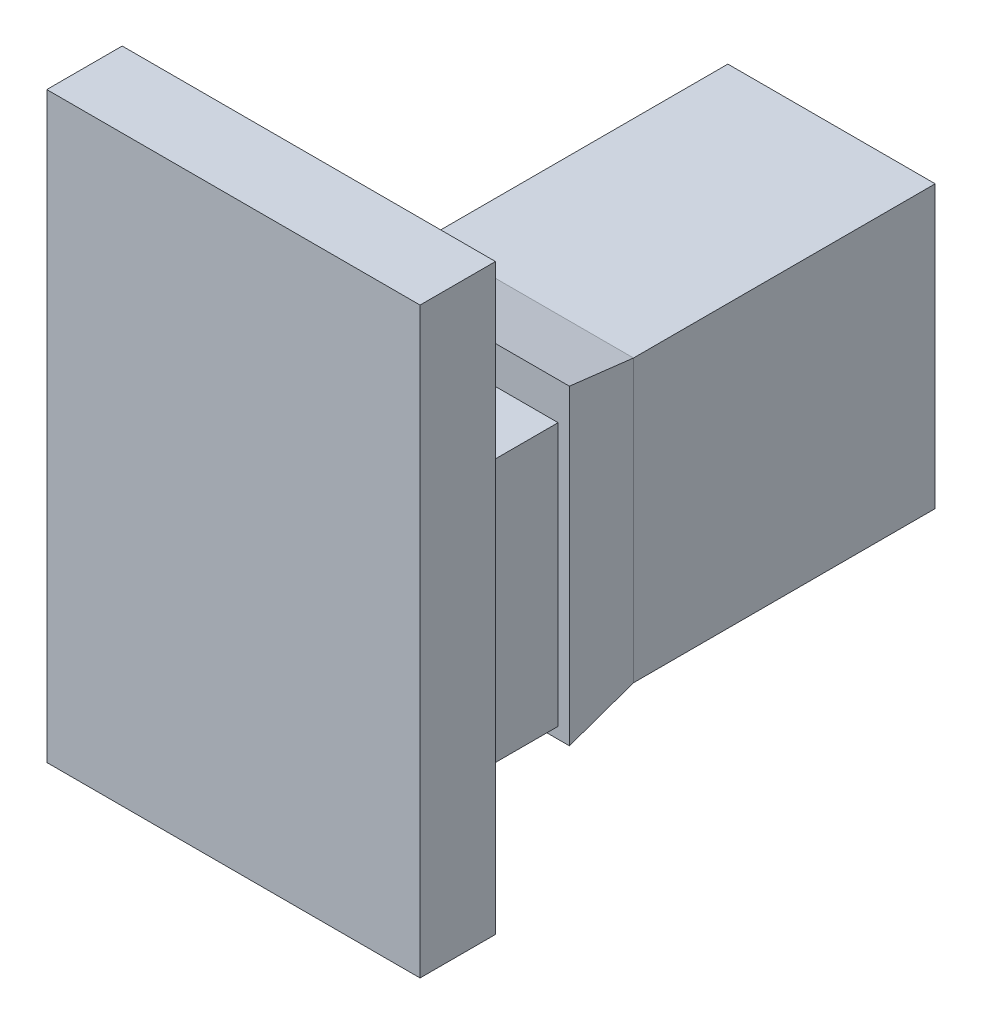
ISO-10303-21;
HEADER;
FILE_DESCRIPTION(('STEP AP214'),'2;1');
FILE_NAME('part.step','',(''),(''),'','','');
FILE_SCHEMA(('AUTOMOTIVE_DESIGN { 1 0 10303 214 1 1 1 1 }'));
ENDSEC;
DATA;
#1=APPLICATION_CONTEXT('core data for automotive mechanical design processes');
#2=APPLICATION_PROTOCOL_DEFINITION('international standard','automotive_design',2000,#1);
#3=PRODUCT_CONTEXT('',#1,'mechanical');
#4=PRODUCT('Part','Part','',(#3));
#5=PRODUCT_RELATED_PRODUCT_CATEGORY('part','',(#4));
#6=PRODUCT_DEFINITION_FORMATION('','',#4);
#7=PRODUCT_DEFINITION_CONTEXT('part definition',#1,'design');
#8=PRODUCT_DEFINITION('design','',#6,#7);
#9=PRODUCT_DEFINITION_SHAPE('','',#8);
#10=(LENGTH_UNIT() NAMED_UNIT(*) SI_UNIT(.MILLI.,.METRE.));
#11=(NAMED_UNIT(*) PLANE_ANGLE_UNIT() SI_UNIT($,.RADIAN.));
#12=(NAMED_UNIT(*) SI_UNIT($,.STERADIAN.) SOLID_ANGLE_UNIT());
#13=UNCERTAINTY_MEASURE_WITH_UNIT(LENGTH_MEASURE(1.E-05),#10,'distance_accuracy_value','');
#14=(GEOMETRIC_REPRESENTATION_CONTEXT(3) GLOBAL_UNCERTAINTY_ASSIGNED_CONTEXT((#13)) GLOBAL_UNIT_ASSIGNED_CONTEXT((#10,
#11,#12)) REPRESENTATION_CONTEXT('',''));
#15=CARTESIAN_POINT('',(0.,0.,0.));
#16=DIRECTION('',(0.,0.,1.));
#17=DIRECTION('',(1.,0.,0.));
#18=AXIS2_PLACEMENT_3D('',#15,#16,#17);
#19=CARTESIAN_POINT('',(-4.1990001587635,-32.943584134306,-1.7));
#20=DIRECTION('',(-1.,0.,0.));
#21=DIRECTION('',(0.,-1.,0.));
#22=AXIS2_PLACEMENT_3D('',#19,#20,#21);
#23=PLANE('',#22);
#24=DIRECTION('',(0.,0.,1.));
#25=VECTOR('',#24,1.);
#26=CARTESIAN_POINT('',(-4.1990001587635,-36.4302303117521,-1.7));
#27=LINE('',#26,#25);
#28=CARTESIAN_POINT('',(-4.1990001587635,-36.4302303117521,-1.7));
#29=VERTEX_POINT('',#28);
#30=CARTESIAN_POINT('',(-4.1990001587635,-36.4302303117521,0.2));
#31=VERTEX_POINT('',#30);
#32=EDGE_CURVE('E516',#29,#31,#27,.T.);
#33=ORIENTED_EDGE('',*,*,#32,.T.);
#34=DIRECTION('',(0.,-1.,0.));
#35=VECTOR('',#34,1.);
#36=CARTESIAN_POINT('',(-4.1990001587635,-32.943584134306,0.2));
#37=LINE('',#36,#35);
#38=CARTESIAN_POINT('',(-4.1990001587635,-32.943584134306,0.2));
#39=VERTEX_POINT('',#38);
#40=EDGE_CURVE('E520',#39,#31,#37,.T.);
#41=ORIENTED_EDGE('',*,*,#40,.F.);
#42=DIRECTION('',(0.,0.,1.));
#43=VECTOR('',#42,1.);
#44=CARTESIAN_POINT('',(-4.1990001587635,-32.943584134306,-1.7));
#45=LINE('',#44,#43);
#46=CARTESIAN_POINT('',(-4.1990001587635,-32.943584134306,-1.7));
#47=VERTEX_POINT('',#46);
#48=EDGE_CURVE('E13',#47,#39,#45,.T.);
#49=ORIENTED_EDGE('',*,*,#48,.F.);
#50=DIRECTION('',(0.,-1.,0.));
#51=VECTOR('',#50,1.);
#52=CARTESIAN_POINT('',(-4.1990001587635,-32.943584134306,-1.7));
#53=LINE('',#52,#51);
#54=EDGE_CURVE('E521',#47,#29,#53,.T.);
#55=ORIENTED_EDGE('',*,*,#54,.T.);
#56=EDGE_LOOP('',(#33,#41,#49,#55));
#57=FACE_BOUND('',#56,.T.);
#58=ADVANCED_FACE('F104',(#57),#23,.T.);
#59=CARTESIAN_POINT('',(-4.1990001587635,-32.943584134306,-1.7));
#60=DIRECTION('',(0.,1.,0.));
#61=DIRECTION('',(0.,0.,1.));
#62=AXIS2_PLACEMENT_3D('',#59,#60,#61);
#63=PLANE('',#62);
#64=ORIENTED_EDGE('',*,*,#48,.T.);
#65=DIRECTION('',(-1.,0.,0.));
#66=VECTOR('',#65,1.);
#67=CARTESIAN_POINT('',(-4.1990001587635,-32.943584134306,0.2));
#68=LINE('',#67,#66);
#69=CARTESIAN_POINT('',(-1.450000158763,-32.943584134306,0.2));
#70=VERTEX_POINT('',#69);
#71=EDGE_CURVE('E537',#70,#39,#68,.T.);
#72=ORIENTED_EDGE('',*,*,#71,.F.);
#73=DIRECTION('',(0.,0.,1.));
#74=VECTOR('',#73,1.);
#75=CARTESIAN_POINT('',(-1.450000158763,-32.943584134306,-1.7));
#76=LINE('',#75,#74);
#77=CARTESIAN_POINT('',(-1.450000158763,-32.943584134306,-1.7));
#78=VERTEX_POINT('',#77);
#79=EDGE_CURVE('E114',#78,#70,#76,.T.);
#80=ORIENTED_EDGE('',*,*,#79,.F.);
#81=DIRECTION('',(-1.,0.,0.));
#82=VECTOR('',#81,1.);
#83=CARTESIAN_POINT('',(-4.1990001587635,-32.943584134306,-1.7));
#84=LINE('',#83,#82);
#85=EDGE_CURVE('E525',#78,#47,#84,.T.);
#86=ORIENTED_EDGE('',*,*,#85,.T.);
#87=EDGE_LOOP('',(#64,#72,#80,#86));
#88=FACE_BOUND('',#87,.T.);
#89=ADVANCED_FACE('F501',(#88),#63,.T.);
#90=CARTESIAN_POINT('',(-1.450000158763,-32.943584134306,-1.7));
#91=DIRECTION('',(1.,0.,0.));
#92=DIRECTION('',(0.,1.,0.));
#93=AXIS2_PLACEMENT_3D('',#90,#91,#92);
#94=PLANE('',#93);
#95=ORIENTED_EDGE('',*,*,#79,.T.);
#96=DIRECTION('',(0.,1.,0.));
#97=VECTOR('',#96,1.);
#98=CARTESIAN_POINT('',(-1.450000158763,-32.943584134306,0.2));
#99=LINE('',#98,#97);
#100=CARTESIAN_POINT('',(-1.450000158763,-36.4302303117521,0.2));
#101=VERTEX_POINT('',#100);
#102=EDGE_CURVE('E533',#101,#70,#99,.T.);
#103=ORIENTED_EDGE('',*,*,#102,.F.);
#104=DIRECTION('',(0.,0.,1.));
#105=VECTOR('',#104,1.);
#106=CARTESIAN_POINT('',(-1.450000158763,-36.4302303117521,-1.7));
#107=LINE('',#106,#105);
#108=CARTESIAN_POINT('',(-1.450000158763,-36.4302303117521,-1.7));
#109=VERTEX_POINT('',#108);
#110=EDGE_CURVE('E524',#109,#101,#107,.T.);
#111=ORIENTED_EDGE('',*,*,#110,.F.);
#112=DIRECTION('',(0.,1.,0.));
#113=VECTOR('',#112,1.);
#114=CARTESIAN_POINT('',(-1.450000158763,-32.943584134306,-1.7));
#115=LINE('',#114,#113);
#116=EDGE_CURVE('E130',#109,#78,#115,.T.);
#117=ORIENTED_EDGE('',*,*,#116,.T.);
#118=EDGE_LOOP('',(#95,#103,#111,#117));
#119=FACE_BOUND('',#118,.T.);
#120=ADVANCED_FACE('F504',(#119),#94,.T.);
#121=CARTESIAN_POINT('',(-4.1990001587635,-36.4302303117521,-1.7));
#122=DIRECTION('',(0.,-1.,0.));
#123=DIRECTION('',(0.,0.,-1.));
#124=AXIS2_PLACEMENT_3D('',#121,#122,#123);
#125=PLANE('',#124);
#126=ORIENTED_EDGE('',*,*,#110,.T.);
#127=DIRECTION('',(1.,0.,0.));
#128=VECTOR('',#127,1.);
#129=CARTESIAN_POINT('',(-4.1990001587635,-36.4302303117521,0.2));
#130=LINE('',#129,#128);
#131=EDGE_CURVE('E528',#31,#101,#130,.T.);
#132=ORIENTED_EDGE('',*,*,#131,.F.);
#133=ORIENTED_EDGE('',*,*,#32,.F.);
#134=DIRECTION('',(1.,0.,0.));
#135=VECTOR('',#134,1.);
#136=CARTESIAN_POINT('',(-4.1990001587635,-36.4302303117521,-1.7));
#137=LINE('',#136,#135);
#138=EDGE_CURVE('E553',#29,#109,#137,.T.);
#139=ORIENTED_EDGE('',*,*,#138,.T.);
#140=EDGE_LOOP('',(#126,#132,#133,#139));
#141=FACE_BOUND('',#140,.T.);
#142=ADVANCED_FACE('F485',(#141),#125,.T.);
#143=CARTESIAN_POINT('',(0.,0.,0.2));
#144=DIRECTION('',(0.,0.,1.));
#145=DIRECTION('',(1.,0.,0.));
#146=AXIS2_PLACEMENT_3D('',#143,#144,#145);
#147=PLANE('',#146);
#148=DIRECTION('',(0.,1.,0.));
#149=VECTOR('',#148,1.);
#150=CARTESIAN_POINT('',(-0.380302431480573,-29.6082267360027,0.2));
#151=LINE('',#150,#149);
#152=CARTESIAN_POINT('',(-0.380302431480572,-37.3350996987134,0.2));
#153=VERTEX_POINT('',#152);
#154=CARTESIAN_POINT('',(-0.380302431480573,-29.6082267360027,0.2));
#155=VERTEX_POINT('',#154);
#156=EDGE_CURVE('E584',#153,#155,#151,.T.);
#157=ORIENTED_EDGE('',*,*,#156,.F.);
#158=DIRECTION('',(1.,0.,0.));
#159=VECTOR('',#158,1.);
#160=CARTESIAN_POINT('',(-5.32928908669653,-37.3350996987134,0.2));
#161=LINE('',#160,#159);
#162=CARTESIAN_POINT('',(-5.32928908669653,-37.3350996987134,0.2));
#163=VERTEX_POINT('',#162);
#164=EDGE_CURVE('E619',#163,#153,#161,.T.);
#165=ORIENTED_EDGE('',*,*,#164,.F.);
#166=DIRECTION('',(0.,-1.,0.));
#167=VECTOR('',#166,1.);
#168=CARTESIAN_POINT('',(-5.32928908669653,-29.6082267360027,0.2));
#169=LINE('',#168,#167);
#170=CARTESIAN_POINT('',(-5.32928908669653,-29.6082267360027,0.2));
#171=VERTEX_POINT('',#170);
#172=EDGE_CURVE('E625',#171,#163,#169,.T.);
#173=ORIENTED_EDGE('',*,*,#172,.F.);
#174=DIRECTION('',(-1.,0.,0.));
#175=VECTOR('',#174,1.);
#176=CARTESIAN_POINT('',(-5.32928908669653,-29.6082267360027,0.2));
#177=LINE('',#176,#175);
#178=EDGE_CURVE('E631',#155,#171,#177,.T.);
#179=ORIENTED_EDGE('',*,*,#178,.F.);
#180=EDGE_LOOP('',(#157,#165,#173,#179));
#181=FACE_BOUND('',#180,.T.);
#182=ORIENTED_EDGE('',*,*,#71,.T.);
#183=ORIENTED_EDGE('',*,*,#40,.T.);
#184=ORIENTED_EDGE('',*,*,#131,.T.);
#185=ORIENTED_EDGE('',*,*,#102,.T.);
#186=EDGE_LOOP('',(#182,#183,#184,#185));
#187=FACE_BOUND('',#186,.T.);
#188=ADVANCED_FACE('F481',(#181,#187),#147,.F.);
#189=CARTESIAN_POINT('',(-0.380302431480573,-29.6082267360027,1.2));
#190=DIRECTION('',(-1.,0.,0.));
#191=DIRECTION('',(0.,-1.,0.));
#192=AXIS2_PLACEMENT_3D('',#189,#190,#191);
#193=PLANE('',#192);
#194=ORIENTED_EDGE('',*,*,#156,.T.);
#195=DIRECTION('',(0.,0.,-1.));
#196=VECTOR('',#195,1.);
#197=CARTESIAN_POINT('',(-0.380302431480573,-29.6082267360027,1.2));
#198=LINE('',#197,#196);
#199=CARTESIAN_POINT('',(-0.380302431480573,-29.6082267360027,1.2));
#200=VERTEX_POINT('',#199);
#201=EDGE_CURVE('E539',#200,#155,#198,.T.);
#202=ORIENTED_EDGE('',*,*,#201,.F.);
#203=DIRECTION('',(0.,1.,0.));
#204=VECTOR('',#203,1.);
#205=CARTESIAN_POINT('',(-0.380302431480573,-29.6082267360027,1.2));
#206=LINE('',#205,#204);
#207=CARTESIAN_POINT('',(-0.380302431480572,-37.3350996987134,1.2));
#208=VERTEX_POINT('',#207);
#209=EDGE_CURVE('E464',#208,#200,#206,.T.);
#210=ORIENTED_EDGE('',*,*,#209,.F.);
#211=DIRECTION('',(0.,0.,-1.));
#212=VECTOR('',#211,1.);
#213=CARTESIAN_POINT('',(-0.380302431480572,-37.3350996987134,1.2));
#214=LINE('',#213,#212);
#215=EDGE_CURVE('E635',#208,#153,#214,.T.);
#216=ORIENTED_EDGE('',*,*,#215,.T.);
#217=EDGE_LOOP('',(#194,#202,#210,#216));
#218=FACE_BOUND('',#217,.T.);
#219=ADVANCED_FACE('F484',(#218),#193,.F.);
#220=CARTESIAN_POINT('',(-5.32928908669653,-29.6082267360027,1.2));
#221=DIRECTION('',(0.,-1.,0.));
#222=DIRECTION('',(0.,0.,-1.));
#223=AXIS2_PLACEMENT_3D('',#220,#221,#222);
#224=PLANE('',#223);
#225=ORIENTED_EDGE('',*,*,#178,.T.);
#226=DIRECTION('',(0.,0.,-1.));
#227=VECTOR('',#226,1.);
#228=CARTESIAN_POINT('',(-5.32928908669653,-29.6082267360027,1.2));
#229=LINE('',#228,#227);
#230=CARTESIAN_POINT('',(-5.32928908669653,-29.6082267360027,1.2));
#231=VERTEX_POINT('',#230);
#232=EDGE_CURVE('E544',#231,#171,#229,.T.);
#233=ORIENTED_EDGE('',*,*,#232,.F.);
#234=DIRECTION('',(-1.,0.,0.));
#235=VECTOR('',#234,1.);
#236=CARTESIAN_POINT('',(-5.32928908669653,-29.6082267360027,1.2));
#237=LINE('',#236,#235);
#238=EDGE_CURVE('E618',#200,#231,#237,.T.);
#239=ORIENTED_EDGE('',*,*,#238,.F.);
#240=ORIENTED_EDGE('',*,*,#201,.T.);
#241=EDGE_LOOP('',(#225,#233,#239,#240));
#242=FACE_BOUND('',#241,.T.);
#243=ADVANCED_FACE('F493',(#242),#224,.F.);
#244=CARTESIAN_POINT('',(-5.32928908669653,-29.6082267360027,1.2));
#245=DIRECTION('',(1.,0.,0.));
#246=DIRECTION('',(0.,1.,0.));
#247=AXIS2_PLACEMENT_3D('',#244,#245,#246);
#248=PLANE('',#247);
#249=ORIENTED_EDGE('',*,*,#172,.T.);
#250=DIRECTION('',(0.,0.,-1.));
#251=VECTOR('',#250,1.);
#252=CARTESIAN_POINT('',(-5.32928908669653,-37.3350996987134,1.2));
#253=LINE('',#252,#251);
#254=CARTESIAN_POINT('',(-5.32928908669653,-37.3350996987134,1.2));
#255=VERTEX_POINT('',#254);
#256=EDGE_CURVE('E638',#255,#163,#253,.T.);
#257=ORIENTED_EDGE('',*,*,#256,.F.);
#258=DIRECTION('',(0.,-1.,0.));
#259=VECTOR('',#258,1.);
#260=CARTESIAN_POINT('',(-5.32928908669653,-29.6082267360027,1.2));
#261=LINE('',#260,#259);
#262=EDGE_CURVE('E623',#231,#255,#261,.T.);
#263=ORIENTED_EDGE('',*,*,#262,.F.);
#264=ORIENTED_EDGE('',*,*,#232,.T.);
#265=EDGE_LOOP('',(#249,#257,#263,#264));
#266=FACE_BOUND('',#265,.T.);
#267=ADVANCED_FACE('F489',(#266),#248,.F.);
#268=CARTESIAN_POINT('',(-5.32928908669653,-37.3350996987134,1.2));
#269=DIRECTION('',(0.,1.,0.));
#270=DIRECTION('',(0.,0.,1.));
#271=AXIS2_PLACEMENT_3D('',#268,#269,#270);
#272=PLANE('',#271);
#273=ORIENTED_EDGE('',*,*,#164,.T.);
#274=ORIENTED_EDGE('',*,*,#215,.F.);
#275=DIRECTION('',(1.,0.,0.));
#276=VECTOR('',#275,1.);
#277=CARTESIAN_POINT('',(-5.32928908669653,-37.3350996987134,1.2));
#278=LINE('',#277,#276);
#279=EDGE_CURVE('E639',#255,#208,#278,.T.);
#280=ORIENTED_EDGE('',*,*,#279,.F.);
#281=ORIENTED_EDGE('',*,*,#256,.T.);
#282=EDGE_LOOP('',(#273,#274,#280,#281));
#283=FACE_BOUND('',#282,.T.);
#284=ADVANCED_FACE('F479',(#283),#272,.F.);
#285=CARTESIAN_POINT('',(0.,0.,1.2));
#286=DIRECTION('',(0.,0.,1.));
#287=DIRECTION('',(1.,0.,0.));
#288=AXIS2_PLACEMENT_3D('',#285,#286,#287);
#289=PLANE('',#288);
#290=ORIENTED_EDGE('',*,*,#209,.T.);
#291=ORIENTED_EDGE('',*,*,#238,.T.);
#292=ORIENTED_EDGE('',*,*,#262,.T.);
#293=ORIENTED_EDGE('',*,*,#279,.T.);
#294=EDGE_LOOP('',(#290,#291,#292,#293));
#295=FACE_BOUND('',#294,.T.);
#296=ADVANCED_FACE('F476',(#295),#289,.T.);
#297=CARTESIAN_POINT('',(0.,0.,-1.7));
#298=DIRECTION('',(0.,0.,1.));
#299=DIRECTION('',(1.,0.,0.));
#300=AXIS2_PLACEMENT_3D('',#297,#298,#299);
#301=PLANE('',#300);
#302=DIRECTION('',(0.,1.,0.));
#303=VECTOR('',#302,1.);
#304=CARTESIAN_POINT('',(-4.2990001587635,-32.4496116621969,-1.7));
#305=LINE('',#304,#303);
#306=CARTESIAN_POINT('',(-4.2990001587635,-36.5795323520586,-1.7));
#307=VERTEX_POINT('',#306);
#308=CARTESIAN_POINT('',(-4.2990001587635,-32.4496116621969,-1.7));
#309=VERTEX_POINT('',#308);
#310=EDGE_CURVE('E312',#307,#309,#305,.T.);
#311=ORIENTED_EDGE('',*,*,#310,.F.);
#312=DIRECTION('',(-1.,0.,0.));
#313=VECTOR('',#312,1.);
#314=CARTESIAN_POINT('',(-4.2990001587635,-36.5795323520586,-1.7));
#315=LINE('',#314,#313);
#316=CARTESIAN_POINT('',(-1.300000158763,-36.5795323520586,-1.7));
#317=VERTEX_POINT('',#316);
#318=EDGE_CURVE('E568',#317,#307,#315,.T.);
#319=ORIENTED_EDGE('',*,*,#318,.F.);
#320=DIRECTION('',(0.,-1.,0.));
#321=VECTOR('',#320,1.);
#322=CARTESIAN_POINT('',(-1.300000158763,-32.4496116621969,-1.7));
#323=LINE('',#322,#321);
#324=CARTESIAN_POINT('',(-1.300000158763,-32.4496116621969,-1.7));
#325=VERTEX_POINT('',#324);
#326=EDGE_CURVE('E573',#325,#317,#323,.T.);
#327=ORIENTED_EDGE('',*,*,#326,.F.);
#328=DIRECTION('',(1.,0.,0.));
#329=VECTOR('',#328,1.);
#330=CARTESIAN_POINT('',(-4.2990001587635,-32.4496116621969,-1.7));
#331=LINE('',#330,#329);
#332=EDGE_CURVE('E578',#309,#325,#331,.T.);
#333=ORIENTED_EDGE('',*,*,#332,.F.);
#334=EDGE_LOOP('',(#311,#319,#327,#333));
#335=FACE_BOUND('',#334,.T.);
#336=ORIENTED_EDGE('',*,*,#54,.F.);
#337=ORIENTED_EDGE('',*,*,#85,.F.);
#338=ORIENTED_EDGE('',*,*,#116,.F.);
#339=ORIENTED_EDGE('',*,*,#138,.F.);
#340=EDGE_LOOP('',(#336,#337,#338,#339));
#341=FACE_BOUND('',#340,.T.);
#342=ADVANCED_FACE('F431',(#335,#341),#301,.T.);
#343=CARTESIAN_POINT('',(-1.450000158763,-36.4302303117521,-2.7));
#344=DIRECTION('',(0.988936352868298,0.,-0.148340452930244));
#345=DIRECTION('',(0.,1.,0.));
#346=AXIS2_PLACEMENT_3D('',#343,#344,#345);
#347=PLANE('',#346);
#348=DIRECTION('',(0.,-1.,0.));
#349=VECTOR('',#348,1.);
#350=CARTESIAN_POINT('',(-1.450000158763,-32.7006216370123,-2.7));
#351=LINE('',#350,#349);
#352=CARTESIAN_POINT('',(-1.450000158763,-32.7006216370123,-2.7));
#353=VERTEX_POINT('',#352);
#354=CARTESIAN_POINT('',(-1.450000158763,-36.4302303117521,-2.7));
#355=VERTEX_POINT('',#354);
#356=EDGE_CURVE('E324',#353,#355,#351,.T.);
#357=ORIENTED_EDGE('',*,*,#356,.F.);
#358=CARTESIAN_POINT('',(-1.450000158763,-32.7006216370123,-2.7));
#359=CARTESIAN_POINT('',(-1.400000158763,-32.6169516454071,-2.36666666666667));
#360=CARTESIAN_POINT('',(-1.350000158763,-32.533281653802,-2.03333333333333));
#361=CARTESIAN_POINT('',(-1.300000158763,-32.4496116621969,-1.7));
#362=B_SPLINE_CURVE_WITH_KNOTS('',3,(#358,#359,#360,#361),.UNSPECIFIED.,.F.,.F.,(4,4),(0.,1.),.UNSPECIFIED.);
#363=EDGE_CURVE('E301',#353,#325,#362,.T.);
#364=ORIENTED_EDGE('',*,*,#363,.T.);
#365=ORIENTED_EDGE('',*,*,#326,.T.);
#366=CARTESIAN_POINT('',(-1.450000158763,-36.4302303117521,-2.7));
#367=CARTESIAN_POINT('',(-1.400000158763,-36.4799976585209,-2.36666666666667));
#368=CARTESIAN_POINT('',(-1.350000158763,-36.5297650052898,-2.03333333333333));
#369=CARTESIAN_POINT('',(-1.300000158763,-36.5795323520586,-1.7));
#370=B_SPLINE_CURVE_WITH_KNOTS('',3,(#366,#367,#368,#369),.UNSPECIFIED.,.F.,.F.,(4,4),(0.,1.),.UNSPECIFIED.);
#371=EDGE_CURVE('E297',#355,#317,#370,.T.);
#372=ORIENTED_EDGE('',*,*,#371,.F.);
#373=EDGE_LOOP('',(#357,#364,#365,#372));
#374=FACE_BOUND('',#373,.T.);
#375=ADVANCED_FACE('F420',(#374),#347,.T.);
#376=CARTESIAN_POINT('',(-4.1990001587635,-36.4302303117521,-2.7));
#377=DIRECTION('',(0.,-0.989037390138069,-0.14766530028709));
#378=DIRECTION('',(1.,0.,0.));
#379=AXIS2_PLACEMENT_3D('',#376,#377,#378);
#380=PLANE('',#379);
#381=DIRECTION('',(-1.,0.,0.));
#382=VECTOR('',#381,1.);
#383=CARTESIAN_POINT('',(-1.450000158763,-36.4302303117521,-2.7));
#384=LINE('',#383,#382);
#385=CARTESIAN_POINT('',(-4.1990001587635,-36.4302303117521,-2.7));
#386=VERTEX_POINT('',#385);
#387=EDGE_CURVE('E107',#355,#386,#384,.T.);
#388=ORIENTED_EDGE('',*,*,#387,.F.);
#389=ORIENTED_EDGE('',*,*,#371,.T.);
#390=ORIENTED_EDGE('',*,*,#318,.T.);
#391=CARTESIAN_POINT('',(-4.1990001587635,-36.4302303117521,-2.7));
#392=CARTESIAN_POINT('',(-4.23233349209683,-36.4799976585209,-2.36666666666667));
#393=CARTESIAN_POINT('',(-4.26566682543017,-36.5297650052898,-2.03333333333333));
#394=CARTESIAN_POINT('',(-4.2990001587635,-36.5795323520586,-1.7));
#395=B_SPLINE_CURVE_WITH_KNOTS('',3,(#391,#392,#393,#394),.UNSPECIFIED.,.F.,.F.,(4,4),(0.,1.),.UNSPECIFIED.);
#396=EDGE_CURVE('E302',#386,#307,#395,.T.);
#397=ORIENTED_EDGE('',*,*,#396,.F.);
#398=EDGE_LOOP('',(#388,#389,#390,#397));
#399=FACE_BOUND('',#398,.T.);
#400=ADVANCED_FACE('F430',(#399),#380,.T.);
#401=CARTESIAN_POINT('',(-4.1990001587635,-32.7006216370123,-2.7));
#402=DIRECTION('',(-0.995037190209989,0.,-0.099503719021));
#403=DIRECTION('',(0.,-1.,0.));
#404=AXIS2_PLACEMENT_3D('',#401,#402,#403);
#405=PLANE('',#404);
#406=DIRECTION('',(0.,1.,0.));
#407=VECTOR('',#406,1.);
#408=CARTESIAN_POINT('',(-4.1990001587635,-36.4302303117521,-2.7));
#409=LINE('',#408,#407);
#410=CARTESIAN_POINT('',(-4.1990001587635,-32.7006216370123,-2.7));
#411=VERTEX_POINT('',#410);
#412=EDGE_CURVE('E397',#386,#411,#409,.T.);
#413=ORIENTED_EDGE('',*,*,#412,.F.);
#414=ORIENTED_EDGE('',*,*,#396,.T.);
#415=ORIENTED_EDGE('',*,*,#310,.T.);
#416=CARTESIAN_POINT('',(-4.1990001587635,-32.7006216370123,-2.7));
#417=CARTESIAN_POINT('',(-4.23233349209683,-32.6169516454071,-2.36666666666667));
#418=CARTESIAN_POINT('',(-4.26566682543017,-32.533281653802,-2.03333333333333));
#419=CARTESIAN_POINT('',(-4.2990001587635,-32.4496116621969,-1.7));
#420=B_SPLINE_CURVE_WITH_KNOTS('',3,(#416,#417,#418,#419),.UNSPECIFIED.,.F.,.F.,(4,4),(0.,1.),.UNSPECIFIED.);
#421=EDGE_CURVE('E317',#411,#309,#420,.T.);
#422=ORIENTED_EDGE('',*,*,#421,.F.);
#423=EDGE_LOOP('',(#413,#414,#415,#422));
#424=FACE_BOUND('',#423,.T.);
#425=ADVANCED_FACE('F435',(#424),#405,.T.);
#426=CARTESIAN_POINT('',(-1.450000158763,-32.7006216370123,-2.7));
#427=DIRECTION('',(0.,0.969911571171899,-0.243457479053035));
#428=DIRECTION('',(-1.,0.,0.));
#429=AXIS2_PLACEMENT_3D('',#426,#427,#428);
#430=PLANE('',#429);
#431=DIRECTION('',(1.,0.,0.));
#432=VECTOR('',#431,1.);
#433=CARTESIAN_POINT('',(-4.1990001587635,-32.7006216370123,-2.7));
#434=LINE('',#433,#432);
#435=EDGE_CURVE('E350',#411,#353,#434,.T.);
#436=ORIENTED_EDGE('',*,*,#435,.F.);
#437=ORIENTED_EDGE('',*,*,#421,.T.);
#438=ORIENTED_EDGE('',*,*,#332,.T.);
#439=ORIENTED_EDGE('',*,*,#363,.F.);
#440=EDGE_LOOP('',(#436,#437,#438,#439));
#441=FACE_BOUND('',#440,.T.);
#442=ADVANCED_FACE('F466',(#441),#430,.T.);
#443=CARTESIAN_POINT('',(-1.450000158763,-32.7006216370123,-6.7));
#444=DIRECTION('',(-1.,0.,0.));
#445=DIRECTION('',(0.,0.,1.));
#446=AXIS2_PLACEMENT_3D('',#443,#444,#445);
#447=PLANE('',#446);
#448=ORIENTED_EDGE('',*,*,#356,.T.);
#449=DIRECTION('',(0.,0.,1.));
#450=VECTOR('',#449,1.);
#451=CARTESIAN_POINT('',(-1.450000158763,-36.4302303117521,-6.7));
#452=LINE('',#451,#450);
#453=CARTESIAN_POINT('',(-1.450000158763,-36.4302303117521,-6.7));
#454=VERTEX_POINT('',#453);
#455=EDGE_CURVE('E587',#454,#355,#452,.T.);
#456=ORIENTED_EDGE('',*,*,#455,.F.);
#457=DIRECTION('',(0.,-1.,0.));
#458=VECTOR('',#457,1.);
#459=CARTESIAN_POINT('',(-1.450000158763,-32.7006216370123,-6.7));
#460=LINE('',#459,#458);
#461=CARTESIAN_POINT('',(-1.450000158763,-32.7006216370123,-6.7));
#462=VERTEX_POINT('',#461);
#463=EDGE_CURVE('E278',#462,#454,#460,.T.);
#464=ORIENTED_EDGE('',*,*,#463,.F.);
#465=DIRECTION('',(0.,0.,1.));
#466=VECTOR('',#465,1.);
#467=CARTESIAN_POINT('',(-1.450000158763,-32.7006216370123,-6.7));
#468=LINE('',#467,#466);
#469=EDGE_CURVE('E296',#462,#353,#468,.T.);
#470=ORIENTED_EDGE('',*,*,#469,.T.);
#471=EDGE_LOOP('',(#448,#456,#464,#470));
#472=FACE_BOUND('',#471,.T.);
#473=ADVANCED_FACE('F475',(#472),#447,.F.);
#474=CARTESIAN_POINT('',(-1.450000158763,-36.4302303117521,-6.7));
#475=DIRECTION('',(0.,1.,0.));
#476=DIRECTION('',(0.,0.,1.));
#477=AXIS2_PLACEMENT_3D('',#474,#475,#476);
#478=PLANE('',#477);
#479=ORIENTED_EDGE('',*,*,#387,.T.);
#480=DIRECTION('',(0.,0.,1.));
#481=VECTOR('',#480,1.);
#482=CARTESIAN_POINT('',(-4.1990001587635,-36.4302303117521,-6.7));
#483=LINE('',#482,#481);
#484=CARTESIAN_POINT('',(-4.1990001587635,-36.4302303117521,-6.7));
#485=VERTEX_POINT('',#484);
#486=EDGE_CURVE('E406',#485,#386,#483,.T.);
#487=ORIENTED_EDGE('',*,*,#486,.F.);
#488=DIRECTION('',(-1.,0.,0.));
#489=VECTOR('',#488,1.);
#490=CARTESIAN_POINT('',(-1.450000158763,-36.4302303117521,-6.7));
#491=LINE('',#490,#489);
#492=EDGE_CURVE('E287',#454,#485,#491,.T.);
#493=ORIENTED_EDGE('',*,*,#492,.F.);
#494=ORIENTED_EDGE('',*,*,#455,.T.);
#495=EDGE_LOOP('',(#479,#487,#493,#494));
#496=FACE_BOUND('',#495,.T.);
#497=ADVANCED_FACE('F387',(#496),#478,.F.);
#498=CARTESIAN_POINT('',(-4.1990001587635,-32.7006216370123,-6.7));
#499=DIRECTION('',(1.,0.,0.));
#500=DIRECTION('',(0.,1.,0.));
#501=AXIS2_PLACEMENT_3D('',#498,#499,#500);
#502=PLANE('',#501);
#503=ORIENTED_EDGE('',*,*,#412,.T.);
#504=DIRECTION('',(0.,0.,1.));
#505=VECTOR('',#504,1.);
#506=CARTESIAN_POINT('',(-4.1990001587635,-32.7006216370123,-6.7));
#507=LINE('',#506,#505);
#508=CARTESIAN_POINT('',(-4.1990001587635,-32.7006216370123,-6.7));
#509=VERTEX_POINT('',#508);
#510=EDGE_CURVE('E358',#509,#411,#507,.T.);
#511=ORIENTED_EDGE('',*,*,#510,.F.);
#512=DIRECTION('',(0.,1.,0.));
#513=VECTOR('',#512,1.);
#514=CARTESIAN_POINT('',(-4.1990001587635,-32.7006216370123,-6.7));
#515=LINE('',#514,#513);
#516=EDGE_CURVE('E290',#485,#509,#515,.T.);
#517=ORIENTED_EDGE('',*,*,#516,.F.);
#518=ORIENTED_EDGE('',*,*,#486,.T.);
#519=EDGE_LOOP('',(#503,#511,#517,#518));
#520=FACE_BOUND('',#519,.T.);
#521=ADVANCED_FACE('F382',(#520),#502,.F.);
#522=CARTESIAN_POINT('',(-1.450000158763,-32.7006216370123,-6.7));
#523=DIRECTION('',(0.,-1.,0.));
#524=DIRECTION('',(0.,0.,-1.));
#525=AXIS2_PLACEMENT_3D('',#522,#523,#524);
#526=PLANE('',#525);
#527=ORIENTED_EDGE('',*,*,#435,.T.);
#528=ORIENTED_EDGE('',*,*,#469,.F.);
#529=DIRECTION('',(1.,0.,0.));
#530=VECTOR('',#529,1.);
#531=CARTESIAN_POINT('',(-1.450000158763,-32.7006216370123,-6.7));
#532=LINE('',#531,#530);
#533=EDGE_CURVE('E293',#509,#462,#532,.T.);
#534=ORIENTED_EDGE('',*,*,#533,.F.);
#535=ORIENTED_EDGE('',*,*,#510,.T.);
#536=EDGE_LOOP('',(#527,#528,#534,#535));
#537=FACE_BOUND('',#536,.T.);
#538=ADVANCED_FACE('F371',(#537),#526,.F.);
#539=CARTESIAN_POINT('',(0.,0.,-6.7));
#540=DIRECTION('',(0.,0.,-1.));
#541=DIRECTION('',(-1.,0.,0.));
#542=AXIS2_PLACEMENT_3D('',#539,#540,#541);
#543=PLANE('',#542);
#544=DIRECTION('',(0.,1.,0.));
#545=VECTOR('',#544,1.);
#546=CARTESIAN_POINT('',(-4.03654375056507,-35.9558958306893,-6.7));
#547=LINE('',#546,#545);
#548=CARTESIAN_POINT('',(-4.03654375056507,-35.9558958306893,-6.7));
#549=VERTEX_POINT('',#548);
#550=CARTESIAN_POINT('',(-4.03654375056507,-33.7535265341684,-6.7));
#551=VERTEX_POINT('',#550);
#552=EDGE_CURVE('E122',#549,#551,#547,.T.);
#553=ORIENTED_EDGE('',*,*,#552,.F.);
#554=DIRECTION('',(-1.,0.,0.));
#555=VECTOR('',#554,1.);
#556=CARTESIAN_POINT('',(-4.03654375056507,-35.9558958306893,-6.7));
#557=LINE('',#556,#555);
#558=CARTESIAN_POINT('',(-1.8156671490311,-35.9558958306893,-6.7));
#559=VERTEX_POINT('',#558);
#560=EDGE_CURVE('E255',#559,#549,#557,.T.);
#561=ORIENTED_EDGE('',*,*,#560,.F.);
#562=DIRECTION('',(0.,-1.,0.));
#563=VECTOR('',#562,1.);
#564=CARTESIAN_POINT('',(-1.8156671490311,-35.9558958306893,-6.7));
#565=LINE('',#564,#563);
#566=CARTESIAN_POINT('',(-1.8156671490311,-33.7535265341684,-6.7));
#567=VERTEX_POINT('',#566);
#568=EDGE_CURVE('E261',#567,#559,#565,.T.);
#569=ORIENTED_EDGE('',*,*,#568,.F.);
#570=DIRECTION('',(1.,0.,0.));
#571=VECTOR('',#570,1.);
#572=CARTESIAN_POINT('',(-4.03654375056507,-33.7535265341684,-6.7));
#573=LINE('',#572,#571);
#574=EDGE_CURVE('E269',#551,#567,#573,.T.);
#575=ORIENTED_EDGE('',*,*,#574,.F.);
#576=EDGE_LOOP('',(#553,#561,#569,#575));
#577=FACE_BOUND('',#576,.T.);
#578=ORIENTED_EDGE('',*,*,#463,.T.);
#579=ORIENTED_EDGE('',*,*,#492,.T.);
#580=ORIENTED_EDGE('',*,*,#516,.T.);
#581=ORIENTED_EDGE('',*,*,#533,.T.);
#582=EDGE_LOOP('',(#578,#579,#580,#581));
#583=FACE_BOUND('',#582,.T.);
#584=ADVANCED_FACE('F381',(#577,#583),#543,.T.);
#585=CARTESIAN_POINT('',(-4.03654375056507,-35.9558958306893,-3.2));
#586=DIRECTION('',(-1.,0.,0.));
#587=DIRECTION('',(0.,0.,1.));
#588=AXIS2_PLACEMENT_3D('',#585,#586,#587);
#589=PLANE('',#588);
#590=ORIENTED_EDGE('',*,*,#552,.T.);
#591=DIRECTION('',(0.,0.,-1.));
#592=VECTOR('',#591,1.);
#593=CARTESIAN_POINT('',(-4.03654375056507,-33.7535265341684,-3.2));
#594=LINE('',#593,#592);
#595=CARTESIAN_POINT('',(-4.03654375056507,-33.7535265341684,-3.2));
#596=VERTEX_POINT('',#595);
#597=EDGE_CURVE('E230',#596,#551,#594,.T.);
#598=ORIENTED_EDGE('',*,*,#597,.F.);
#599=DIRECTION('',(0.,1.,0.));
#600=VECTOR('',#599,1.);
#601=CARTESIAN_POINT('',(-4.03654375056507,-35.9558958306893,-3.2));
#602=LINE('',#601,#600);
#603=CARTESIAN_POINT('',(-4.03654375056507,-35.9558958306893,-3.2));
#604=VERTEX_POINT('',#603);
#605=EDGE_CURVE('E234',#604,#596,#602,.T.);
#606=ORIENTED_EDGE('',*,*,#605,.F.);
#607=DIRECTION('',(0.,0.,-1.));
#608=VECTOR('',#607,1.);
#609=CARTESIAN_POINT('',(-4.03654375056507,-35.9558958306893,-3.2));
#610=LINE('',#609,#608);
#611=EDGE_CURVE('E275',#604,#549,#610,.T.);
#612=ORIENTED_EDGE('',*,*,#611,.T.);
#613=EDGE_LOOP('',(#590,#598,#606,#612));
#614=FACE_BOUND('',#613,.T.);
#615=ADVANCED_FACE('F232',(#614),#589,.F.);
#616=CARTESIAN_POINT('',(-4.03654375056507,-35.9558958306893,-3.2));
#617=DIRECTION('',(0.,-1.,0.));
#618=DIRECTION('',(0.,0.,-1.));
#619=AXIS2_PLACEMENT_3D('',#616,#617,#618);
#620=PLANE('',#619);
#621=ORIENTED_EDGE('',*,*,#560,.T.);
#622=ORIENTED_EDGE('',*,*,#611,.F.);
#623=DIRECTION('',(-1.,0.,0.));
#624=VECTOR('',#623,1.);
#625=CARTESIAN_POINT('',(-4.03654375056507,-35.9558958306893,-3.2));
#626=LINE('',#625,#624);
#627=CARTESIAN_POINT('',(-1.8156671490311,-35.9558958306893,-3.2));
#628=VERTEX_POINT('',#627);
#629=EDGE_CURVE('E241',#628,#604,#626,.T.);
#630=ORIENTED_EDGE('',*,*,#629,.F.);
#631=DIRECTION('',(0.,0.,-1.));
#632=VECTOR('',#631,1.);
#633=CARTESIAN_POINT('',(-1.8156671490311,-35.9558958306893,-3.2));
#634=LINE('',#633,#632);
#635=EDGE_CURVE('E279',#628,#559,#634,.T.);
#636=ORIENTED_EDGE('',*,*,#635,.T.);
#637=EDGE_LOOP('',(#621,#622,#630,#636));
#638=FACE_BOUND('',#637,.T.);
#639=ADVANCED_FACE('F703',(#638),#620,.F.);
#640=CARTESIAN_POINT('',(-1.8156671490311,-35.9558958306893,-3.2));
#641=DIRECTION('',(1.,0.,0.));
#642=DIRECTION('',(0.,0.,-1.));
#643=AXIS2_PLACEMENT_3D('',#640,#641,#642);
#644=PLANE('',#643);
#645=ORIENTED_EDGE('',*,*,#568,.T.);
#646=ORIENTED_EDGE('',*,*,#635,.F.);
#647=DIRECTION('',(0.,-1.,0.));
#648=VECTOR('',#647,1.);
#649=CARTESIAN_POINT('',(-1.8156671490311,-35.9558958306893,-3.2));
#650=LINE('',#649,#648);
#651=CARTESIAN_POINT('',(-1.8156671490311,-33.7535265341684,-3.2));
#652=VERTEX_POINT('',#651);
#653=EDGE_CURVE('E250',#652,#628,#650,.T.);
#654=ORIENTED_EDGE('',*,*,#653,.F.);
#655=DIRECTION('',(0.,0.,-1.));
#656=VECTOR('',#655,1.);
#657=CARTESIAN_POINT('',(-1.8156671490311,-33.7535265341684,-3.2));
#658=LINE('',#657,#656);
#659=EDGE_CURVE('E240',#652,#567,#658,.T.);
#660=ORIENTED_EDGE('',*,*,#659,.T.);
#661=EDGE_LOOP('',(#645,#646,#654,#660));
#662=FACE_BOUND('',#661,.T.);
#663=ADVANCED_FACE('F708',(#662),#644,.F.);
#664=CARTESIAN_POINT('',(-4.03654375056507,-33.7535265341684,-3.2));
#665=DIRECTION('',(0.,1.,0.));
#666=DIRECTION('',(0.,0.,1.));
#667=AXIS2_PLACEMENT_3D('',#664,#665,#666);
#668=PLANE('',#667);
#669=ORIENTED_EDGE('',*,*,#574,.T.);
#670=ORIENTED_EDGE('',*,*,#659,.F.);
#671=DIRECTION('',(1.,0.,0.));
#672=VECTOR('',#671,1.);
#673=CARTESIAN_POINT('',(-4.03654375056507,-33.7535265341684,-3.2));
#674=LINE('',#673,#672);
#675=EDGE_CURVE('E244',#596,#652,#674,.T.);
#676=ORIENTED_EDGE('',*,*,#675,.F.);
#677=ORIENTED_EDGE('',*,*,#597,.T.);
#678=EDGE_LOOP('',(#669,#670,#676,#677));
#679=FACE_BOUND('',#678,.T.);
#680=ADVANCED_FACE('F245',(#679),#668,.F.);
#681=CARTESIAN_POINT('',(0.,0.,-3.2));
#682=DIRECTION('',(0.,0.,-1.));
#683=DIRECTION('',(-1.,0.,0.));
#684=AXIS2_PLACEMENT_3D('',#681,#682,#683);
#685=PLANE('',#684);
#686=ORIENTED_EDGE('',*,*,#605,.T.);
#687=ORIENTED_EDGE('',*,*,#675,.T.);
#688=ORIENTED_EDGE('',*,*,#653,.T.);
#689=ORIENTED_EDGE('',*,*,#629,.T.);
#690=EDGE_LOOP('',(#686,#687,#688,#689));
#691=FACE_BOUND('',#690,.T.);
#692=ADVANCED_FACE('F252',(#691),#685,.T.);
#693=CLOSED_SHELL('',(#58,#89,#120,#142,#188,#219,#243,#267,#284,#296,#342,#375,#400,#425,#442,
#473,#497,#521,#538,#584,#615,#639,#663,#680,#692));
#694=MANIFOLD_SOLID_BREP('B2',#693);
#695=ADVANCED_BREP_SHAPE_REPRESENTATION('',(#18,#694),#14);
#696=SHAPE_DEFINITION_REPRESENTATION(#9,#695);
ENDSEC;
END-ISO-10303-21;
